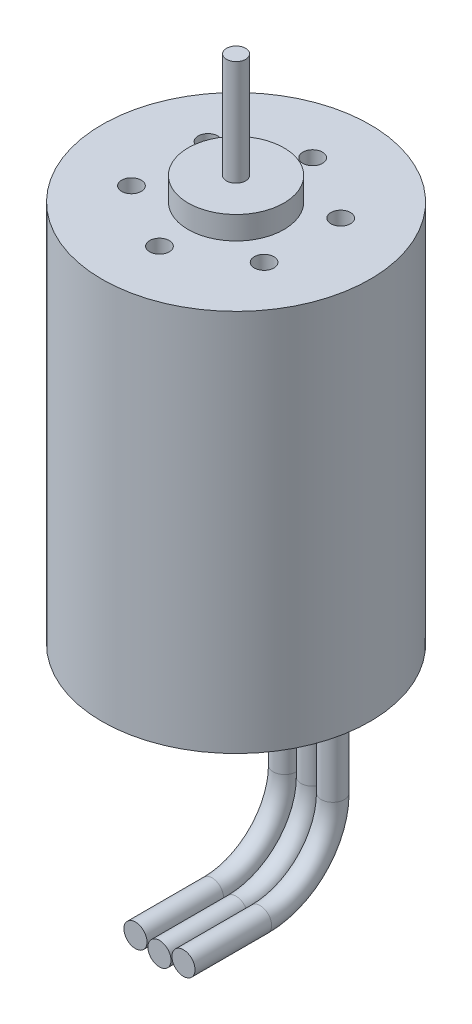
ISO-10303-21;
HEADER;
FILE_DESCRIPTION(('STEP AP214'),'2;1');
FILE_NAME('part.step','',(''),(''),'','','');
FILE_SCHEMA(('AUTOMOTIVE_DESIGN { 1 0 10303 214 1 1 1 1 }'));
ENDSEC;
DATA;
#1=APPLICATION_CONTEXT('core data for automotive mechanical design processes');
#2=APPLICATION_PROTOCOL_DEFINITION('international standard','automotive_design',2000,#1);
#3=PRODUCT_CONTEXT('',#1,'mechanical');
#4=PRODUCT('Part','Part','',(#3));
#5=PRODUCT_RELATED_PRODUCT_CATEGORY('part','',(#4));
#6=PRODUCT_DEFINITION_FORMATION('','',#4);
#7=PRODUCT_DEFINITION_CONTEXT('part definition',#1,'design');
#8=PRODUCT_DEFINITION('design','',#6,#7);
#9=PRODUCT_DEFINITION_SHAPE('','',#8);
#10=(LENGTH_UNIT() NAMED_UNIT(*) SI_UNIT(.MILLI.,.METRE.));
#11=(NAMED_UNIT(*) PLANE_ANGLE_UNIT() SI_UNIT($,.RADIAN.));
#12=(NAMED_UNIT(*) SI_UNIT($,.STERADIAN.) SOLID_ANGLE_UNIT());
#13=UNCERTAINTY_MEASURE_WITH_UNIT(LENGTH_MEASURE(1.E-05),#10,'distance_accuracy_value','');
#14=(GEOMETRIC_REPRESENTATION_CONTEXT(3) GLOBAL_UNCERTAINTY_ASSIGNED_CONTEXT((#13)) GLOBAL_UNIT_ASSIGNED_CONTEXT((#10,
#11,#12)) REPRESENTATION_CONTEXT('',''));
#15=CARTESIAN_POINT('',(0.,0.,0.));
#16=DIRECTION('',(0.,0.,1.));
#17=DIRECTION('',(1.,0.,0.));
#18=AXIS2_PLACEMENT_3D('',#15,#16,#17);
#19=CARTESIAN_POINT('',(0.,55.8,0.));
#20=DIRECTION('',(0.,1.,0.));
#21=DIRECTION('',(0.,0.,-1.));
#22=AXIS2_PLACEMENT_3D('',#19,#20,#21);
#23=PLANE('',#22);
#24=CARTESIAN_POINT('',(0.,55.8,0.));
#25=DIRECTION('',(0.,1.,0.));
#26=DIRECTION('',(0.,0.,1.));
#27=AXIS2_PLACEMENT_3D('',#24,#25,#26);
#28=CIRCLE('',#27,1.);
#29=CARTESIAN_POINT('',(0.,55.8,1.));
#30=VERTEX_POINT('',#29);
#31=EDGE_CURVE('E42',#30,#30,#28,.T.);
#32=ORIENTED_EDGE('',*,*,#31,.T.);
#33=EDGE_LOOP('',(#32));
#34=FACE_BOUND('',#33,.T.);
#35=ADVANCED_FACE('F39',(#34),#23,.T.);
#36=CARTESIAN_POINT('',(0.,0.,0.));
#37=DIRECTION('',(0.,-1.,0.));
#38=DIRECTION('',(0.,0.,1.));
#39=AXIS2_PLACEMENT_3D('',#36,#37,#38);
#40=CYLINDRICAL_SURFACE('',#39,1.);
#41=ORIENTED_EDGE('',*,*,#31,.F.);
#42=EDGE_LOOP('',(#41));
#43=FACE_BOUND('',#42,.T.);
#44=CARTESIAN_POINT('',(0.,44.8,0.));
#45=DIRECTION('',(0.,1.,0.));
#46=DIRECTION('',(0.,0.,1.));
#47=AXIS2_PLACEMENT_3D('',#44,#45,#46);
#48=CIRCLE('',#47,1.);
#49=CARTESIAN_POINT('',(0.,44.8,1.));
#50=VERTEX_POINT('',#49);
#51=EDGE_CURVE('E131',#50,#50,#48,.T.);
#52=ORIENTED_EDGE('',*,*,#51,.T.);
#53=EDGE_LOOP('',(#52));
#54=FACE_BOUND('',#53,.T.);
#55=ADVANCED_FACE('F172',(#43,#54),#40,.T.);
#56=CARTESIAN_POINT('',(1.,44.8,0.));
#57=DIRECTION('',(0.,1.,0.));
#58=DIRECTION('',(0.,0.,-1.));
#59=AXIS2_PLACEMENT_3D('',#56,#57,#58);
#60=PLANE('',#59);
#61=ORIENTED_EDGE('',*,*,#51,.F.);
#62=EDGE_LOOP('',(#61));
#63=FACE_BOUND('',#62,.T.);
#64=CARTESIAN_POINT('',(0.,44.8,0.));
#65=DIRECTION('',(0.,1.,0.));
#66=DIRECTION('',(0.,0.,1.));
#67=AXIS2_PLACEMENT_3D('',#64,#65,#66);
#68=CIRCLE('',#67,4.99999999999999);
#69=CARTESIAN_POINT('',(0.,44.8,4.99999999999999));
#70=VERTEX_POINT('',#69);
#71=EDGE_CURVE('E129',#70,#70,#68,.T.);
#72=ORIENTED_EDGE('',*,*,#71,.T.);
#73=EDGE_LOOP('',(#72));
#74=FACE_BOUND('',#73,.T.);
#75=ADVANCED_FACE('F176',(#63,#74),#60,.T.);
#76=CARTESIAN_POINT('',(0.,0.,0.));
#77=DIRECTION('',(0.,-1.,0.));
#78=DIRECTION('',(0.,0.,1.));
#79=AXIS2_PLACEMENT_3D('',#76,#77,#78);
#80=CYLINDRICAL_SURFACE('',#79,4.99999999999999);
#81=ORIENTED_EDGE('',*,*,#71,.F.);
#82=EDGE_LOOP('',(#81));
#83=FACE_BOUND('',#82,.T.);
#84=CARTESIAN_POINT('',(0.,42.4,0.));
#85=DIRECTION('',(0.,1.,0.));
#86=DIRECTION('',(0.,0.,1.));
#87=AXIS2_PLACEMENT_3D('',#84,#85,#86);
#88=CIRCLE('',#87,4.99999999999999);
#89=CARTESIAN_POINT('',(0.,42.4,4.99999999999999));
#90=VERTEX_POINT('',#89);
#91=EDGE_CURVE('E126',#90,#90,#88,.T.);
#92=ORIENTED_EDGE('',*,*,#91,.T.);
#93=EDGE_LOOP('',(#92));
#94=FACE_BOUND('',#93,.T.);
#95=ADVANCED_FACE('F181',(#83,#94),#80,.T.);
#96=CARTESIAN_POINT('',(4.99999999999999,42.4,0.));
#97=DIRECTION('',(0.,1.,0.));
#98=DIRECTION('',(0.,0.,-1.));
#99=AXIS2_PLACEMENT_3D('',#96,#97,#98);
#100=PLANE('',#99);
#101=CARTESIAN_POINT('',(-6.92820323027546,42.4,4.00000000000008));
#102=DIRECTION('',(0.,-1.,0.));
#103=DIRECTION('',(0.,0.,-1.));
#104=AXIS2_PLACEMENT_3D('',#101,#102,#103);
#105=CIRCLE('',#104,1.025);
#106=CARTESIAN_POINT('',(-6.92820323027546,42.4,2.97500000000008));
#107=VERTEX_POINT('',#106);
#108=EDGE_CURVE('E78',#107,#107,#105,.T.);
#109=ORIENTED_EDGE('',*,*,#108,.T.);
#110=EDGE_LOOP('',(#109));
#111=FACE_BOUND('',#110,.T.);
#112=CARTESIAN_POINT('',(-6.92820323027555,42.4,-3.99999999999994));
#113=DIRECTION('',(0.,-1.,0.));
#114=DIRECTION('',(0.,0.,-1.));
#115=AXIS2_PLACEMENT_3D('',#112,#113,#114);
#116=CIRCLE('',#115,1.025);
#117=CARTESIAN_POINT('',(-6.92820323027555,42.4,-5.02499999999994));
#118=VERTEX_POINT('',#117);
#119=EDGE_CURVE('E77',#118,#118,#116,.T.);
#120=ORIENTED_EDGE('',*,*,#119,.T.);
#121=EDGE_LOOP('',(#120));
#122=FACE_BOUND('',#121,.T.);
#123=CARTESIAN_POINT('',(0.,42.4,-8.));
#124=DIRECTION('',(0.,-1.,0.));
#125=DIRECTION('',(0.,0.,-1.));
#126=AXIS2_PLACEMENT_3D('',#123,#124,#125);
#127=CIRCLE('',#126,1.025);
#128=CARTESIAN_POINT('',(0.,42.4,-9.025));
#129=VERTEX_POINT('',#128);
#130=EDGE_CURVE('E90',#129,#129,#127,.T.);
#131=ORIENTED_EDGE('',*,*,#130,.T.);
#132=EDGE_LOOP('',(#131));
#133=FACE_BOUND('',#132,.T.);
#134=CARTESIAN_POINT('',(6.92820323027549,42.4,-4.00000000000003));
#135=DIRECTION('',(0.,-1.,0.));
#136=DIRECTION('',(0.,0.,-1.));
#137=AXIS2_PLACEMENT_3D('',#134,#135,#136);
#138=CIRCLE('',#137,1.025);
#139=CARTESIAN_POINT('',(6.92820323027549,42.4,-5.02500000000003));
#140=VERTEX_POINT('',#139);
#141=EDGE_CURVE('E96',#140,#140,#138,.T.);
#142=ORIENTED_EDGE('',*,*,#141,.T.);
#143=EDGE_LOOP('',(#142));
#144=FACE_BOUND('',#143,.T.);
#145=CARTESIAN_POINT('',(6.92820323027552,42.4,3.99999999999998));
#146=DIRECTION('',(0.,-1.,0.));
#147=DIRECTION('',(0.,0.,-1.));
#148=AXIS2_PLACEMENT_3D('',#145,#146,#147);
#149=CIRCLE('',#148,1.025);
#150=CARTESIAN_POINT('',(6.92820323027552,42.4,2.97499999999999));
#151=VERTEX_POINT('',#150);
#152=EDGE_CURVE('E102',#151,#151,#149,.T.);
#153=ORIENTED_EDGE('',*,*,#152,.T.);
#154=EDGE_LOOP('',(#153));
#155=FACE_BOUND('',#154,.T.);
#156=CARTESIAN_POINT('',(0.,42.4,8.));
#157=DIRECTION('',(0.,-1.,0.));
#158=DIRECTION('',(0.,0.,-1.));
#159=AXIS2_PLACEMENT_3D('',#156,#157,#158);
#160=CIRCLE('',#159,1.025);
#161=CARTESIAN_POINT('',(0.,42.4,6.975));
#162=VERTEX_POINT('',#161);
#163=EDGE_CURVE('E108',#162,#162,#160,.T.);
#164=ORIENTED_EDGE('',*,*,#163,.T.);
#165=EDGE_LOOP('',(#164));
#166=FACE_BOUND('',#165,.T.);
#167=ORIENTED_EDGE('',*,*,#91,.F.);
#168=EDGE_LOOP('',(#167));
#169=FACE_BOUND('',#168,.T.);
#170=CARTESIAN_POINT('',(0.,42.4,0.));
#171=DIRECTION('',(0.,1.,0.));
#172=DIRECTION('',(0.,0.,1.));
#173=AXIS2_PLACEMENT_3D('',#170,#171,#172);
#174=CIRCLE('',#173,14.);
#175=CARTESIAN_POINT('',(0.,42.4,14.));
#176=VERTEX_POINT('',#175);
#177=EDGE_CURVE('E123',#176,#176,#174,.T.);
#178=ORIENTED_EDGE('',*,*,#177,.T.);
#179=EDGE_LOOP('',(#178));
#180=FACE_BOUND('',#179,.T.);
#181=ADVANCED_FACE('F187',(#111,#122,#133,#144,#155,#166,#169,#180),#100,.T.);
#182=CARTESIAN_POINT('',(0.,0.,0.));
#183=DIRECTION('',(0.,-1.,0.));
#184=DIRECTION('',(0.,0.,1.));
#185=AXIS2_PLACEMENT_3D('',#182,#183,#184);
#186=CYLINDRICAL_SURFACE('',#185,14.);
#187=ORIENTED_EDGE('',*,*,#177,.F.);
#188=EDGE_LOOP('',(#187));
#189=FACE_BOUND('',#188,.T.);
#190=CARTESIAN_POINT('',(0.,2.4,0.));
#191=DIRECTION('',(0.,1.,0.));
#192=DIRECTION('',(0.,0.,1.));
#193=AXIS2_PLACEMENT_3D('',#190,#191,#192);
#194=CIRCLE('',#193,14.);
#195=CARTESIAN_POINT('',(0.,2.4,14.));
#196=VERTEX_POINT('',#195);
#197=EDGE_CURVE('E120',#196,#196,#194,.T.);
#198=ORIENTED_EDGE('',*,*,#197,.T.);
#199=EDGE_LOOP('',(#198));
#200=FACE_BOUND('',#199,.T.);
#201=ADVANCED_FACE('F191',(#189,#200),#186,.T.);
#202=CARTESIAN_POINT('',(5.,2.4,0.));
#203=DIRECTION('',(0.,-1.,0.));
#204=DIRECTION('',(0.,0.,1.));
#205=AXIS2_PLACEMENT_3D('',#202,#203,#204);
#206=PLANE('',#205);
#207=CARTESIAN_POINT('',(-2.50778978372889,2.4,-7.596775));
#208=DIRECTION('',(0.,1.,0.));
#209=DIRECTION('',(0.,0.,1.));
#210=AXIS2_PLACEMENT_3D('',#207,#208,#209);
#211=CIRCLE('',#210,1.2065);
#212=CARTESIAN_POINT('',(-2.50778978372889,2.4,-6.390275));
#213=VERTEX_POINT('',#212);
#214=EDGE_CURVE('E11',#213,#213,#211,.T.);
#215=ORIENTED_EDGE('',*,*,#214,.T.);
#216=EDGE_LOOP('',(#215));
#217=FACE_BOUND('',#216,.T.);
#218=CARTESIAN_POINT('',(0.,2.4,-8.));
#219=DIRECTION('',(0.,1.,0.));
#220=DIRECTION('',(0.,0.,1.));
#221=AXIS2_PLACEMENT_3D('',#218,#219,#220);
#222=CIRCLE('',#221,1.2065);
#223=CARTESIAN_POINT('',(0.,2.4,-6.7935));
#224=VERTEX_POINT('',#223);
#225=EDGE_CURVE('E47',#224,#224,#222,.T.);
#226=ORIENTED_EDGE('',*,*,#225,.T.);
#227=EDGE_LOOP('',(#226));
#228=FACE_BOUND('',#227,.T.);
#229=CARTESIAN_POINT('',(2.50778978372889,2.4,-7.596775));
#230=DIRECTION('',(0.,1.,0.));
#231=DIRECTION('',(0.,0.,1.));
#232=AXIS2_PLACEMENT_3D('',#229,#230,#231);
#233=CIRCLE('',#232,1.2065);
#234=CARTESIAN_POINT('',(2.50778978372889,2.4,-6.390275));
#235=VERTEX_POINT('',#234);
#236=EDGE_CURVE('E136',#235,#235,#233,.T.);
#237=ORIENTED_EDGE('',*,*,#236,.T.);
#238=EDGE_LOOP('',(#237));
#239=FACE_BOUND('',#238,.T.);
#240=ORIENTED_EDGE('',*,*,#197,.F.);
#241=EDGE_LOOP('',(#240));
#242=FACE_BOUND('',#241,.T.);
#243=CARTESIAN_POINT('',(0.,2.4,0.));
#244=DIRECTION('',(0.,1.,0.));
#245=DIRECTION('',(0.,0.,1.));
#246=AXIS2_PLACEMENT_3D('',#243,#244,#245);
#247=CIRCLE('',#246,5.);
#248=CARTESIAN_POINT('',(0.,2.4,5.));
#249=VERTEX_POINT('',#248);
#250=EDGE_CURVE('E117',#249,#249,#247,.T.);
#251=ORIENTED_EDGE('',*,*,#250,.T.);
#252=EDGE_LOOP('',(#251));
#253=FACE_BOUND('',#252,.T.);
#254=ADVANCED_FACE('F195',(#217,#228,#239,#242,#253),#206,.T.);
#255=CARTESIAN_POINT('',(0.,0.,0.));
#256=DIRECTION('',(0.,-1.,0.));
#257=DIRECTION('',(0.,0.,1.));
#258=AXIS2_PLACEMENT_3D('',#255,#256,#257);
#259=CYLINDRICAL_SURFACE('',#258,5.);
#260=ORIENTED_EDGE('',*,*,#250,.F.);
#261=EDGE_LOOP('',(#260));
#262=FACE_BOUND('',#261,.T.);
#263=CARTESIAN_POINT('',(0.,0.,0.));
#264=DIRECTION('',(0.,1.,0.));
#265=DIRECTION('',(0.,0.,1.));
#266=AXIS2_PLACEMENT_3D('',#263,#264,#265);
#267=CIRCLE('',#266,5.);
#268=CARTESIAN_POINT('',(0.,0.,5.));
#269=VERTEX_POINT('',#268);
#270=EDGE_CURVE('E114',#269,#269,#267,.T.);
#271=ORIENTED_EDGE('',*,*,#270,.T.);
#272=EDGE_LOOP('',(#271));
#273=FACE_BOUND('',#272,.T.);
#274=ADVANCED_FACE('F199',(#262,#273),#259,.T.);
#275=CARTESIAN_POINT('',(0.,0.,0.));
#276=DIRECTION('',(0.,-1.,0.));
#277=DIRECTION('',(0.,0.,1.));
#278=AXIS2_PLACEMENT_3D('',#275,#276,#277);
#279=PLANE('',#278);
#280=ORIENTED_EDGE('',*,*,#270,.F.);
#281=EDGE_LOOP('',(#280));
#282=FACE_BOUND('',#281,.T.);
#283=ADVANCED_FACE('F203',(#282),#279,.T.);
#284=CARTESIAN_POINT('',(0.,38.400008,8.));
#285=DIRECTION('',(0.,1.,0.));
#286=DIRECTION('',(0.,0.,-1.));
#287=AXIS2_PLACEMENT_3D('',#284,#285,#286);
#288=CONICAL_SURFACE('',#287,1.025,1.02974425867665);
#289=CARTESIAN_POINT('',(0.,37.7841258654968,8.));
#290=VERTEX_POINT('',#289);
#291=VERTEX_LOOP('',#290);
#292=FACE_BOUND('',#291,.T.);
#293=CARTESIAN_POINT('',(0.,38.400008,8.));
#294=DIRECTION('',(0.,-1.,0.));
#295=DIRECTION('',(0.,0.,-1.));
#296=AXIS2_PLACEMENT_3D('',#293,#294,#295);
#297=CIRCLE('',#296,1.025);
#298=CARTESIAN_POINT('',(0.,38.400008,6.975));
#299=VERTEX_POINT('',#298);
#300=EDGE_CURVE('E111',#299,#299,#297,.T.);
#301=ORIENTED_EDGE('',*,*,#300,.F.);
#302=EDGE_LOOP('',(#301));
#303=FACE_BOUND('',#302,.T.);
#304=ADVANCED_FACE('F207',(#292,#303),#288,.F.);
#305=CARTESIAN_POINT('',(0.,42.4,8.));
#306=DIRECTION('',(0.,1.,0.));
#307=DIRECTION('',(0.,0.,-1.));
#308=AXIS2_PLACEMENT_3D('',#305,#306,#307);
#309=CYLINDRICAL_SURFACE('',#308,1.025);
#310=ORIENTED_EDGE('',*,*,#300,.T.);
#311=EDGE_LOOP('',(#310));
#312=FACE_BOUND('',#311,.T.);
#313=ORIENTED_EDGE('',*,*,#163,.F.);
#314=EDGE_LOOP('',(#313));
#315=FACE_BOUND('',#314,.T.);
#316=ADVANCED_FACE('F211',(#312,#315),#309,.F.);
#317=CARTESIAN_POINT('',(6.92820323027552,38.400008,3.99999999999998));
#318=DIRECTION('',(0.,1.,0.));
#319=DIRECTION('',(0.,0.,-1.));
#320=AXIS2_PLACEMENT_3D('',#317,#318,#319);
#321=CONICAL_SURFACE('',#320,1.025,1.02974425867666);
#322=CARTESIAN_POINT('',(6.92820323027552,37.7841258654968,3.99999999999998));
#323=VERTEX_POINT('',#322);
#324=VERTEX_LOOP('',#323);
#325=FACE_BOUND('',#324,.T.);
#326=CARTESIAN_POINT('',(6.92820323027552,38.400008,3.99999999999998));
#327=DIRECTION('',(0.,-1.,0.));
#328=DIRECTION('',(0.,0.,-1.));
#329=AXIS2_PLACEMENT_3D('',#326,#327,#328);
#330=CIRCLE('',#329,1.025);
#331=CARTESIAN_POINT('',(6.92820323027552,38.400008,2.97499999999999));
#332=VERTEX_POINT('',#331);
#333=EDGE_CURVE('E105',#332,#332,#330,.T.);
#334=ORIENTED_EDGE('',*,*,#333,.F.);
#335=EDGE_LOOP('',(#334));
#336=FACE_BOUND('',#335,.T.);
#337=ADVANCED_FACE('F214',(#325,#336),#321,.F.);
#338=CARTESIAN_POINT('',(6.92820323027552,42.4,3.99999999999998));
#339=DIRECTION('',(0.,1.,0.));
#340=DIRECTION('',(0.,0.,-1.));
#341=AXIS2_PLACEMENT_3D('',#338,#339,#340);
#342=CYLINDRICAL_SURFACE('',#341,1.025);
#343=ORIENTED_EDGE('',*,*,#333,.T.);
#344=EDGE_LOOP('',(#343));
#345=FACE_BOUND('',#344,.T.);
#346=ORIENTED_EDGE('',*,*,#152,.F.);
#347=EDGE_LOOP('',(#346));
#348=FACE_BOUND('',#347,.T.);
#349=ADVANCED_FACE('F218',(#345,#348),#342,.F.);
#350=CARTESIAN_POINT('',(6.92820323027549,38.400008,-4.00000000000003));
#351=DIRECTION('',(0.,1.,0.));
#352=DIRECTION('',(0.,0.,-1.));
#353=AXIS2_PLACEMENT_3D('',#350,#351,#352);
#354=CONICAL_SURFACE('',#353,1.025,1.02974425867665);
#355=CARTESIAN_POINT('',(6.92820323027549,37.7841258654968,-4.00000000000003));
#356=VERTEX_POINT('',#355);
#357=VERTEX_LOOP('',#356);
#358=FACE_BOUND('',#357,.T.);
#359=CARTESIAN_POINT('',(6.92820323027549,38.400008,-4.00000000000003));
#360=DIRECTION('',(0.,-1.,0.));
#361=DIRECTION('',(0.,0.,-1.));
#362=AXIS2_PLACEMENT_3D('',#359,#360,#361);
#363=CIRCLE('',#362,1.025);
#364=CARTESIAN_POINT('',(6.92820323027549,38.400008,-5.02500000000003));
#365=VERTEX_POINT('',#364);
#366=EDGE_CURVE('E99',#365,#365,#363,.T.);
#367=ORIENTED_EDGE('',*,*,#366,.F.);
#368=EDGE_LOOP('',(#367));
#369=FACE_BOUND('',#368,.T.);
#370=ADVANCED_FACE('F221',(#358,#369),#354,.F.);
#371=CARTESIAN_POINT('',(6.92820323027549,42.4,-4.00000000000003));
#372=DIRECTION('',(0.,1.,0.));
#373=DIRECTION('',(0.,0.,-1.));
#374=AXIS2_PLACEMENT_3D('',#371,#372,#373);
#375=CYLINDRICAL_SURFACE('',#374,1.025);
#376=ORIENTED_EDGE('',*,*,#366,.T.);
#377=EDGE_LOOP('',(#376));
#378=FACE_BOUND('',#377,.T.);
#379=ORIENTED_EDGE('',*,*,#141,.F.);
#380=EDGE_LOOP('',(#379));
#381=FACE_BOUND('',#380,.T.);
#382=ADVANCED_FACE('F225',(#378,#381),#375,.F.);
#383=CARTESIAN_POINT('',(0.,38.400008,-8.));
#384=DIRECTION('',(0.,1.,0.));
#385=DIRECTION('',(0.,0.,-1.));
#386=AXIS2_PLACEMENT_3D('',#383,#384,#385);
#387=CONICAL_SURFACE('',#386,1.025,1.02974425867665);
#388=CARTESIAN_POINT('',(0.,37.7841258654968,-8.));
#389=VERTEX_POINT('',#388);
#390=VERTEX_LOOP('',#389);
#391=FACE_BOUND('',#390,.T.);
#392=CARTESIAN_POINT('',(0.,38.400008,-8.));
#393=DIRECTION('',(0.,-1.,0.));
#394=DIRECTION('',(0.,0.,-1.));
#395=AXIS2_PLACEMENT_3D('',#392,#393,#394);
#396=CIRCLE('',#395,1.025);
#397=CARTESIAN_POINT('',(0.,38.400008,-9.025));
#398=VERTEX_POINT('',#397);
#399=EDGE_CURVE('E93',#398,#398,#396,.T.);
#400=ORIENTED_EDGE('',*,*,#399,.F.);
#401=EDGE_LOOP('',(#400));
#402=FACE_BOUND('',#401,.T.);
#403=ADVANCED_FACE('F229',(#391,#402),#387,.F.);
#404=CARTESIAN_POINT('',(0.,42.4,-8.));
#405=DIRECTION('',(0.,1.,0.));
#406=DIRECTION('',(0.,0.,-1.));
#407=AXIS2_PLACEMENT_3D('',#404,#405,#406);
#408=CYLINDRICAL_SURFACE('',#407,1.025);
#409=ORIENTED_EDGE('',*,*,#399,.T.);
#410=EDGE_LOOP('',(#409));
#411=FACE_BOUND('',#410,.T.);
#412=ORIENTED_EDGE('',*,*,#130,.F.);
#413=EDGE_LOOP('',(#412));
#414=FACE_BOUND('',#413,.T.);
#415=ADVANCED_FACE('F233',(#411,#414),#408,.F.);
#416=CARTESIAN_POINT('',(-6.92820323027555,38.400008,-3.99999999999994));
#417=DIRECTION('',(0.,1.,0.));
#418=DIRECTION('',(0.,0.,-1.));
#419=AXIS2_PLACEMENT_3D('',#416,#417,#418);
#420=CONICAL_SURFACE('',#419,1.025,1.02974425867665);
#421=CARTESIAN_POINT('',(-6.92820323027555,37.7841258654968,-3.99999999999994));
#422=VERTEX_POINT('',#421);
#423=VERTEX_LOOP('',#422);
#424=FACE_BOUND('',#423,.T.);
#425=CARTESIAN_POINT('',(-6.92820323027555,38.400008,-3.99999999999994));
#426=DIRECTION('',(0.,-1.,0.));
#427=DIRECTION('',(0.,0.,-1.));
#428=AXIS2_PLACEMENT_3D('',#425,#426,#427);
#429=CIRCLE('',#428,1.025);
#430=CARTESIAN_POINT('',(-6.92820323027555,38.400008,-5.02499999999993));
#431=VERTEX_POINT('',#430);
#432=EDGE_CURVE('E81',#431,#431,#429,.T.);
#433=ORIENTED_EDGE('',*,*,#432,.F.);
#434=EDGE_LOOP('',(#433));
#435=FACE_BOUND('',#434,.T.);
#436=ADVANCED_FACE('F237',(#424,#435),#420,.F.);
#437=CARTESIAN_POINT('',(-6.92820323027555,42.4,-3.99999999999994));
#438=DIRECTION('',(0.,1.,0.));
#439=DIRECTION('',(0.,0.,-1.));
#440=AXIS2_PLACEMENT_3D('',#437,#438,#439);
#441=CYLINDRICAL_SURFACE('',#440,1.025);
#442=ORIENTED_EDGE('',*,*,#432,.T.);
#443=EDGE_LOOP('',(#442));
#444=FACE_BOUND('',#443,.T.);
#445=ORIENTED_EDGE('',*,*,#119,.F.);
#446=EDGE_LOOP('',(#445));
#447=FACE_BOUND('',#446,.T.);
#448=ADVANCED_FACE('F71',(#444,#447),#441,.F.);
#449=CARTESIAN_POINT('',(-6.92820323027546,38.400008,4.00000000000008));
#450=DIRECTION('',(0.,1.,0.));
#451=DIRECTION('',(0.,0.,-1.));
#452=AXIS2_PLACEMENT_3D('',#449,#450,#451);
#453=CONICAL_SURFACE('',#452,1.025,1.02974425867665);
#454=CARTESIAN_POINT('',(-6.92820323027546,37.7841258654968,4.00000000000008));
#455=VERTEX_POINT('',#454);
#456=VERTEX_LOOP('',#455);
#457=FACE_BOUND('',#456,.T.);
#458=CARTESIAN_POINT('',(-6.92820323027546,38.400008,4.00000000000008));
#459=DIRECTION('',(0.,-1.,0.));
#460=DIRECTION('',(0.,0.,-1.));
#461=AXIS2_PLACEMENT_3D('',#458,#459,#460);
#462=CIRCLE('',#461,1.025);
#463=CARTESIAN_POINT('',(-6.92820323027546,38.400008,2.97500000000008));
#464=VERTEX_POINT('',#463);
#465=EDGE_CURVE('E75',#464,#464,#462,.T.);
#466=ORIENTED_EDGE('',*,*,#465,.F.);
#467=EDGE_LOOP('',(#466));
#468=FACE_BOUND('',#467,.T.);
#469=ADVANCED_FACE('F67',(#457,#468),#453,.F.);
#470=CARTESIAN_POINT('',(-6.92820323027546,42.4,4.00000000000008));
#471=DIRECTION('',(0.,1.,0.));
#472=DIRECTION('',(0.,0.,-1.));
#473=AXIS2_PLACEMENT_3D('',#470,#471,#472);
#474=CYLINDRICAL_SURFACE('',#473,1.025);
#475=ORIENTED_EDGE('',*,*,#465,.T.);
#476=EDGE_LOOP('',(#475));
#477=FACE_BOUND('',#476,.T.);
#478=ORIENTED_EDGE('',*,*,#108,.F.);
#479=EDGE_LOOP('',(#478));
#480=FACE_BOUND('',#479,.T.);
#481=ADVANCED_FACE('F70',(#477,#480),#474,.F.);
#482=CARTESIAN_POINT('',(2.50778978372889,-21.196775,0.));
#483=DIRECTION('',(0.,0.,1.));
#484=DIRECTION('',(-1.,0.,0.));
#485=AXIS2_PLACEMENT_3D('',#482,#483,#484);
#486=CYLINDRICAL_SURFACE('',#485,1.2065);
#487=CARTESIAN_POINT('',(2.50778978372889,-21.196775,0.));
#488=DIRECTION('',(0.,0.,-1.));
#489=DIRECTION('',(0.,1.,0.));
#490=AXIS2_PLACEMENT_3D('',#487,#488,#489);
#491=CIRCLE('',#490,1.2065);
#492=CARTESIAN_POINT('',(2.50778978372889,-22.403275,0.));
#493=VERTEX_POINT('',#492);
#494=EDGE_CURVE('E149',#493,#493,#491,.T.);
#495=ORIENTED_EDGE('',*,*,#494,.F.);
#496=EDGE_LOOP('',(#495));
#497=FACE_BOUND('',#496,.T.);
#498=CARTESIAN_POINT('',(2.50778978372889,-21.196775,8.00000000000001));
#499=DIRECTION('',(0.,0.,-1.));
#500=DIRECTION('',(0.,1.,0.));
#501=AXIS2_PLACEMENT_3D('',#498,#499,#500);
#502=CIRCLE('',#501,1.2065);
#503=CARTESIAN_POINT('',(2.50778978372889,-19.990275,8.00000000000001));
#504=VERTEX_POINT('',#503);
#505=EDGE_CURVE('E84',#504,#504,#502,.T.);
#506=ORIENTED_EDGE('',*,*,#505,.T.);
#507=EDGE_LOOP('',(#506));
#508=FACE_BOUND('',#507,.T.);
#509=ADVANCED_FACE('F154',(#497,#508),#486,.T.);
#510=CARTESIAN_POINT('',(2.50778978372889,-13.6,0.));
#511=DIRECTION('',(1.,0.,0.));
#512=DIRECTION('',(0.,0.,1.));
#513=AXIS2_PLACEMENT_3D('',#510,#511,#512);
#514=TOROIDAL_SURFACE('',#513,7.596775,1.2065);
#515=CARTESIAN_POINT('',(2.50778978372889,-13.6,-7.596775));
#516=DIRECTION('',(0.,1.,0.));
#517=DIRECTION('',(0.,0.,1.));
#518=AXIS2_PLACEMENT_3D('',#515,#516,#517);
#519=CIRCLE('',#518,1.2065);
#520=CARTESIAN_POINT('',(2.50778978372889,-13.6,-8.803275));
#521=VERTEX_POINT('',#520);
#522=EDGE_CURVE('E147',#521,#521,#519,.T.);
#523=CARTESIAN_POINT('',(2.50778978372889,-13.6,0.));
#524=DIRECTION('',(1.,0.,0.));
#525=DIRECTION('',(0.,0.,1.));
#526=AXIS2_PLACEMENT_3D('',#523,#524,#525);
#527=CIRCLE('',#526,8.803275);
#528=EDGE_CURVE('',#493,#521,#527,.T.);
#529=ORIENTED_EDGE('',*,*,#494,.T.);
#530=ORIENTED_EDGE('',*,*,#522,.F.);
#531=ORIENTED_EDGE('',*,*,#528,.T.);
#532=ORIENTED_EDGE('',*,*,#528,.F.);
#533=EDGE_LOOP('',(#529,#531,#530,#532));
#534=FACE_BOUND('',#533,.T.);
#535=ADVANCED_FACE('F168',(#534),#514,.T.);
#536=CARTESIAN_POINT('',(2.50778978372889,-13.6,-7.596775));
#537=DIRECTION('',(0.,1.,0.));
#538=DIRECTION('',(0.,0.,-1.));
#539=AXIS2_PLACEMENT_3D('',#536,#537,#538);
#540=CYLINDRICAL_SURFACE('',#539,1.2065);
#541=ORIENTED_EDGE('',*,*,#522,.T.);
#542=EDGE_LOOP('',(#541));
#543=FACE_BOUND('',#542,.T.);
#544=ORIENTED_EDGE('',*,*,#236,.F.);
#545=EDGE_LOOP('',(#544));
#546=FACE_BOUND('',#545,.T.);
#547=ADVANCED_FACE('F159',(#543,#546),#540,.T.);
#548=CARTESIAN_POINT('',(2.50778978372889,-21.196775,8.00000000000001));
#549=DIRECTION('',(0.,0.,1.));
#550=DIRECTION('',(0.,1.,0.));
#551=AXIS2_PLACEMENT_3D('',#548,#549,#550);
#552=PLANE('',#551);
#553=ORIENTED_EDGE('',*,*,#505,.F.);
#554=EDGE_LOOP('',(#553));
#555=FACE_BOUND('',#554,.T.);
#556=ADVANCED_FACE('F156',(#555),#552,.T.);
#557=CARTESIAN_POINT('',(0.,-21.6,0.));
#558=DIRECTION('',(0.,0.,1.));
#559=DIRECTION('',(-1.,0.,0.));
#560=AXIS2_PLACEMENT_3D('',#557,#558,#559);
#561=CYLINDRICAL_SURFACE('',#560,1.2065);
#562=CARTESIAN_POINT('',(0.,-21.6,0.));
#563=DIRECTION('',(0.,0.,-1.));
#564=DIRECTION('',(0.,1.,0.));
#565=AXIS2_PLACEMENT_3D('',#562,#563,#564);
#566=CIRCLE('',#565,1.2065);
#567=CARTESIAN_POINT('',(0.,-22.8065,0.));
#568=VERTEX_POINT('',#567);
#569=EDGE_CURVE('E260',#568,#568,#566,.T.);
#570=ORIENTED_EDGE('',*,*,#569,.F.);
#571=EDGE_LOOP('',(#570));
#572=FACE_BOUND('',#571,.T.);
#573=CARTESIAN_POINT('',(0.,-21.6,8.00000000000001));
#574=DIRECTION('',(0.,0.,-1.));
#575=DIRECTION('',(0.,1.,0.));
#576=AXIS2_PLACEMENT_3D('',#573,#574,#575);
#577=CIRCLE('',#576,1.2065);
#578=CARTESIAN_POINT('',(0.,-20.3935,8.00000000000001));
#579=VERTEX_POINT('',#578);
#580=EDGE_CURVE('E258',#579,#579,#577,.T.);
#581=ORIENTED_EDGE('',*,*,#580,.T.);
#582=EDGE_LOOP('',(#581));
#583=FACE_BOUND('',#582,.T.);
#584=ADVANCED_FACE('F158',(#572,#583),#561,.T.);
#585=CARTESIAN_POINT('',(0.,-13.6,0.));
#586=DIRECTION('',(1.,0.,0.));
#587=DIRECTION('',(0.,0.,1.));
#588=AXIS2_PLACEMENT_3D('',#585,#586,#587);
#589=TOROIDAL_SURFACE('',#588,8.,1.2065);
#590=CARTESIAN_POINT('',(0.,-13.6,-8.));
#591=DIRECTION('',(0.,1.,0.));
#592=DIRECTION('',(0.,0.,1.));
#593=AXIS2_PLACEMENT_3D('',#590,#591,#592);
#594=CIRCLE('',#593,1.2065);
#595=CARTESIAN_POINT('',(0.,-13.6,-9.2065));
#596=VERTEX_POINT('',#595);
#597=EDGE_CURVE('E264',#596,#596,#594,.T.);
#598=CARTESIAN_POINT('',(0.,-13.6,0.));
#599=DIRECTION('',(1.,0.,0.));
#600=DIRECTION('',(0.,0.,1.));
#601=AXIS2_PLACEMENT_3D('',#598,#599,#600);
#602=CIRCLE('',#601,9.2065);
#603=EDGE_CURVE('',#568,#596,#602,.T.);
#604=ORIENTED_EDGE('',*,*,#569,.T.);
#605=ORIENTED_EDGE('',*,*,#597,.F.);
#606=ORIENTED_EDGE('',*,*,#603,.T.);
#607=ORIENTED_EDGE('',*,*,#603,.F.);
#608=EDGE_LOOP('',(#604,#606,#605,#607));
#609=FACE_BOUND('',#608,.T.);
#610=ADVANCED_FACE('F165',(#609),#589,.T.);
#611=CARTESIAN_POINT('',(0.,-13.6,-8.));
#612=DIRECTION('',(0.,1.,0.));
#613=DIRECTION('',(0.,0.,-1.));
#614=AXIS2_PLACEMENT_3D('',#611,#612,#613);
#615=CYLINDRICAL_SURFACE('',#614,1.2065);
#616=ORIENTED_EDGE('',*,*,#597,.T.);
#617=EDGE_LOOP('',(#616));
#618=FACE_BOUND('',#617,.T.);
#619=ORIENTED_EDGE('',*,*,#225,.F.);
#620=EDGE_LOOP('',(#619));
#621=FACE_BOUND('',#620,.T.);
#622=ADVANCED_FACE('F305',(#618,#621),#615,.T.);
#623=CARTESIAN_POINT('',(0.,-21.6,8.00000000000001));
#624=DIRECTION('',(0.,0.,1.));
#625=DIRECTION('',(0.,1.,0.));
#626=AXIS2_PLACEMENT_3D('',#623,#624,#625);
#627=PLANE('',#626);
#628=ORIENTED_EDGE('',*,*,#580,.F.);
#629=EDGE_LOOP('',(#628));
#630=FACE_BOUND('',#629,.T.);
#631=ADVANCED_FACE('F291',(#630),#627,.T.);
#632=CARTESIAN_POINT('',(-2.50778978372889,-21.196775,0.));
#633=DIRECTION('',(0.,0.,1.));
#634=DIRECTION('',(-1.,0.,0.));
#635=AXIS2_PLACEMENT_3D('',#632,#633,#634);
#636=CYLINDRICAL_SURFACE('',#635,1.2065);
#637=CARTESIAN_POINT('',(-2.50778978372889,-21.196775,0.));
#638=DIRECTION('',(0.,0.,-1.));
#639=DIRECTION('',(0.,1.,0.));
#640=AXIS2_PLACEMENT_3D('',#637,#638,#639);
#641=CIRCLE('',#640,1.2065);
#642=CARTESIAN_POINT('',(-2.50778978372889,-22.403275,0.));
#643=VERTEX_POINT('',#642);
#644=EDGE_CURVE('E272',#643,#643,#641,.T.);
#645=ORIENTED_EDGE('',*,*,#644,.F.);
#646=EDGE_LOOP('',(#645));
#647=FACE_BOUND('',#646,.T.);
#648=CARTESIAN_POINT('',(-2.50778978372889,-21.196775,8.00000000000001));
#649=DIRECTION('',(0.,0.,-1.));
#650=DIRECTION('',(0.,1.,0.));
#651=AXIS2_PLACEMENT_3D('',#648,#649,#650);
#652=CIRCLE('',#651,1.2065);
#653=CARTESIAN_POINT('',(-2.50778978372889,-19.990275,8.00000000000001));
#654=VERTEX_POINT('',#653);
#655=EDGE_CURVE('E269',#654,#654,#652,.T.);
#656=ORIENTED_EDGE('',*,*,#655,.T.);
#657=EDGE_LOOP('',(#656));
#658=FACE_BOUND('',#657,.T.);
#659=ADVANCED_FACE('F285',(#647,#658),#636,.T.);
#660=CARTESIAN_POINT('',(-2.50778978372889,-13.6,0.));
#661=DIRECTION('',(1.,0.,0.));
#662=DIRECTION('',(0.,0.,1.));
#663=AXIS2_PLACEMENT_3D('',#660,#661,#662);
#664=TOROIDAL_SURFACE('',#663,7.596775,1.2065);
#665=CARTESIAN_POINT('',(-2.50778978372889,-13.6,-7.596775));
#666=DIRECTION('',(0.,1.,0.));
#667=DIRECTION('',(0.,0.,1.));
#668=AXIS2_PLACEMENT_3D('',#665,#666,#667);
#669=CIRCLE('',#668,1.2065);
#670=CARTESIAN_POINT('',(-2.50778978372889,-13.6,-8.803275));
#671=VERTEX_POINT('',#670);
#672=EDGE_CURVE('E274',#671,#671,#669,.T.);
#673=CARTESIAN_POINT('',(-2.50778978372889,-13.6,0.));
#674=DIRECTION('',(1.,0.,0.));
#675=DIRECTION('',(0.,0.,1.));
#676=AXIS2_PLACEMENT_3D('',#673,#674,#675);
#677=CIRCLE('',#676,8.803275);
#678=EDGE_CURVE('',#643,#671,#677,.T.);
#679=ORIENTED_EDGE('',*,*,#644,.T.);
#680=ORIENTED_EDGE('',*,*,#672,.F.);
#681=ORIENTED_EDGE('',*,*,#678,.T.);
#682=ORIENTED_EDGE('',*,*,#678,.F.);
#683=EDGE_LOOP('',(#679,#681,#680,#682));
#684=FACE_BOUND('',#683,.T.);
#685=ADVANCED_FACE('F282',(#684),#664,.T.);
#686=CARTESIAN_POINT('',(-2.50778978372889,-13.6,-7.596775));
#687=DIRECTION('',(0.,1.,0.));
#688=DIRECTION('',(0.,0.,-1.));
#689=AXIS2_PLACEMENT_3D('',#686,#687,#688);
#690=CYLINDRICAL_SURFACE('',#689,1.2065);
#691=ORIENTED_EDGE('',*,*,#672,.T.);
#692=EDGE_LOOP('',(#691));
#693=FACE_BOUND('',#692,.T.);
#694=ORIENTED_EDGE('',*,*,#214,.F.);
#695=EDGE_LOOP('',(#694));
#696=FACE_BOUND('',#695,.T.);
#697=ADVANCED_FACE('F279',(#693,#696),#690,.T.);
#698=CARTESIAN_POINT('',(-2.50778978372889,-21.196775,8.00000000000001));
#699=DIRECTION('',(0.,0.,1.));
#700=DIRECTION('',(0.,1.,0.));
#701=AXIS2_PLACEMENT_3D('',#698,#699,#700);
#702=PLANE('',#701);
#703=ORIENTED_EDGE('',*,*,#655,.F.);
#704=EDGE_LOOP('',(#703));
#705=FACE_BOUND('',#704,.T.);
#706=ADVANCED_FACE('F295',(#705),#702,.T.);
#707=CLOSED_SHELL('',(#35,#55,#75,#95,#181,#201,#254,#274,#283,#304,#316,#337,#349,#370,#382,
#403,#415,#436,#448,#469,#481,#509,#535,#547,#556,#584,#610,#622,#631,#659,#685,#697,#706));
#708=MANIFOLD_SOLID_BREP('B2',#707);
#709=ADVANCED_BREP_SHAPE_REPRESENTATION('',(#18,#708),#14);
#710=SHAPE_DEFINITION_REPRESENTATION(#9,#709);
ENDSEC;
END-ISO-10303-21;
